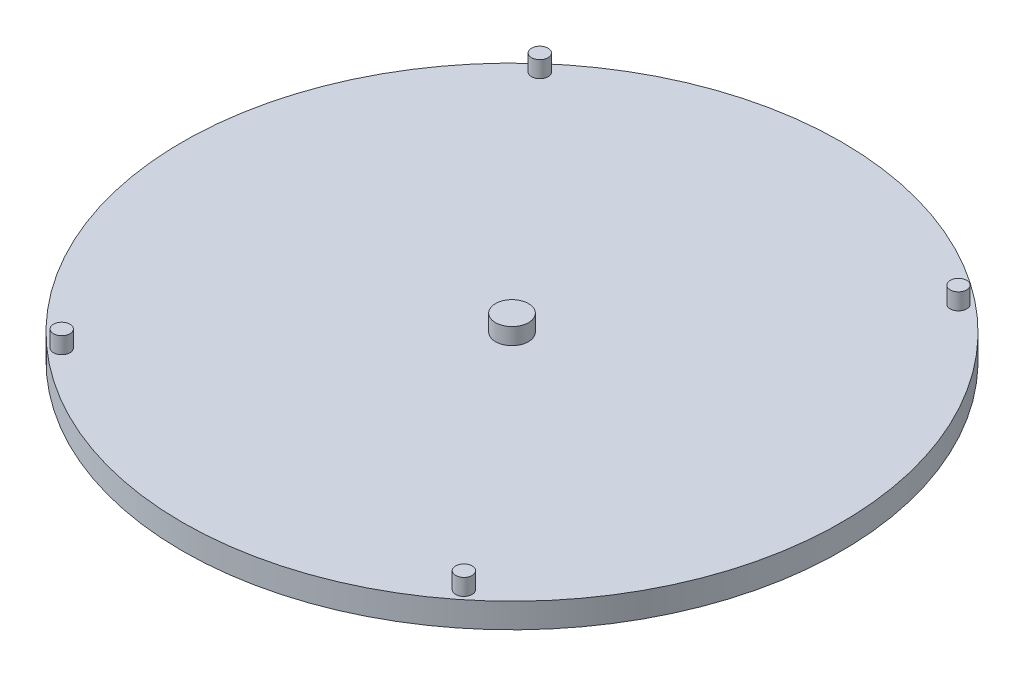
ISO-10303-21;
HEADER;
FILE_DESCRIPTION(('STEP AP214'),'2;1');
FILE_NAME('part.step','',(''),(''),'','','');
FILE_SCHEMA(('AUTOMOTIVE_DESIGN { 1 0 10303 214 1 1 1 1 }'));
ENDSEC;
DATA;
#1=APPLICATION_CONTEXT('core data for automotive mechanical design processes');
#2=APPLICATION_PROTOCOL_DEFINITION('international standard','automotive_design',2000,#1);
#3=PRODUCT_CONTEXT('',#1,'mechanical');
#4=PRODUCT('Part','Part','',(#3));
#5=PRODUCT_RELATED_PRODUCT_CATEGORY('part','',(#4));
#6=PRODUCT_DEFINITION_FORMATION('','',#4);
#7=PRODUCT_DEFINITION_CONTEXT('part definition',#1,'design');
#8=PRODUCT_DEFINITION('design','',#6,#7);
#9=PRODUCT_DEFINITION_SHAPE('','',#8);
#10=(LENGTH_UNIT() NAMED_UNIT(*) SI_UNIT(.MILLI.,.METRE.));
#11=(NAMED_UNIT(*) PLANE_ANGLE_UNIT() SI_UNIT($,.RADIAN.));
#12=(NAMED_UNIT(*) SI_UNIT($,.STERADIAN.) SOLID_ANGLE_UNIT());
#13=UNCERTAINTY_MEASURE_WITH_UNIT(LENGTH_MEASURE(1.E-05),#10,'distance_accuracy_value','');
#14=(GEOMETRIC_REPRESENTATION_CONTEXT(3) GLOBAL_UNCERTAINTY_ASSIGNED_CONTEXT((#13)) GLOBAL_UNIT_ASSIGNED_CONTEXT((#10,
#11,#12)) REPRESENTATION_CONTEXT('',''));
#15=CARTESIAN_POINT('',(0.,0.,0.));
#16=DIRECTION('',(0.,0.,1.));
#17=DIRECTION('',(1.,0.,0.));
#18=AXIS2_PLACEMENT_3D('',#15,#16,#17);
#19=CARTESIAN_POINT('',(0.,3.,0.));
#20=DIRECTION('',(0.,1.,0.));
#21=DIRECTION('',(0.,0.,1.));
#22=AXIS2_PLACEMENT_3D('',#19,#20,#21);
#23=PLANE('',#22);
#24=CARTESIAN_POINT('',(0.,3.,0.));
#25=DIRECTION('',(0.,1.,0.));
#26=DIRECTION('',(0.,0.,1.));
#27=AXIS2_PLACEMENT_3D('',#24,#25,#26);
#28=CIRCLE('',#27,2.);
#29=CARTESIAN_POINT('',(0.,3.,2.));
#30=VERTEX_POINT('',#29);
#31=EDGE_CURVE('E74',#30,#30,#28,.T.);
#32=ORIENTED_EDGE('',*,*,#31,.F.);
#33=EDGE_LOOP('',(#32));
#34=FACE_BOUND('',#33,.T.);
#35=CARTESIAN_POINT('',(24.1039137179365,3.,29.932057928602));
#36=DIRECTION('',(0.,1.,0.));
#37=DIRECTION('',(0.,0.,1.));
#38=AXIS2_PLACEMENT_3D('',#35,#36,#37);
#39=CIRCLE('',#38,1.);
#40=CARTESIAN_POINT('',(24.1039137179365,3.,30.932057928602));
#41=VERTEX_POINT('',#40);
#42=EDGE_CURVE('E55',#41,#41,#39,.T.);
#43=ORIENTED_EDGE('',*,*,#42,.F.);
#44=EDGE_LOOP('',(#43));
#45=FACE_BOUND('',#44,.T.);
#46=CARTESIAN_POINT('',(24.1039137179365,3.,-29.9806765580856));
#47=DIRECTION('',(0.,1.,0.));
#48=DIRECTION('',(0.,0.,1.));
#49=AXIS2_PLACEMENT_3D('',#46,#47,#48);
#50=CIRCLE('',#49,1.);
#51=CARTESIAN_POINT('',(24.1039137179365,3.,-28.9806765580856));
#52=VERTEX_POINT('',#51);
#53=EDGE_CURVE('E48',#52,#52,#50,.T.);
#54=ORIENTED_EDGE('',*,*,#53,.F.);
#55=EDGE_LOOP('',(#54));
#56=FACE_BOUND('',#55,.T.);
#57=CARTESIAN_POINT('',(0.,3.,0.));
#58=DIRECTION('',(0.,1.,0.));
#59=DIRECTION('',(0.,0.,1.));
#60=AXIS2_PLACEMENT_3D('',#57,#58,#59);
#61=CIRCLE('',#60,39.9214841251947);
#62=CARTESIAN_POINT('',(0.,3.,39.9214841251947));
#63=VERTEX_POINT('',#62);
#64=EDGE_CURVE('E10',#63,#63,#61,.T.);
#65=ORIENTED_EDGE('',*,*,#64,.T.);
#66=EDGE_LOOP('',(#65));
#67=FACE_BOUND('',#66,.T.);
#68=CARTESIAN_POINT('',(-25.6103171257812,3.,-28.9806765580856));
#69=DIRECTION('',(0.,1.,0.));
#70=DIRECTION('',(0.,0.,1.));
#71=AXIS2_PLACEMENT_3D('',#68,#69,#70);
#72=CIRCLE('',#71,1.);
#73=CARTESIAN_POINT('',(-25.6103171257812,3.,-27.9806765580856));
#74=VERTEX_POINT('',#73);
#75=EDGE_CURVE('E52',#74,#74,#72,.T.);
#76=ORIENTED_EDGE('',*,*,#75,.F.);
#77=EDGE_LOOP('',(#76));
#78=FACE_BOUND('',#77,.T.);
#79=CARTESIAN_POINT('',(-25.6103171257812,3.,28.932057928602));
#80=DIRECTION('',(0.,1.,0.));
#81=DIRECTION('',(0.,0.,1.));
#82=AXIS2_PLACEMENT_3D('',#79,#80,#81);
#83=CIRCLE('',#82,1.);
#84=CARTESIAN_POINT('',(-25.6103171257812,3.,29.932057928602));
#85=VERTEX_POINT('',#84);
#86=EDGE_CURVE('E58',#85,#85,#83,.T.);
#87=ORIENTED_EDGE('',*,*,#86,.F.);
#88=EDGE_LOOP('',(#87));
#89=FACE_BOUND('',#88,.T.);
#90=ADVANCED_FACE('F37',(#34,#45,#56,#67,#78,#89),#23,.T.);
#91=CARTESIAN_POINT('',(0.,0.,0.));
#92=DIRECTION('',(0.,1.,0.));
#93=DIRECTION('',(0.,0.,1.));
#94=AXIS2_PLACEMENT_3D('',#91,#92,#93);
#95=PLANE('',#94);
#96=CARTESIAN_POINT('',(0.,0.,0.));
#97=DIRECTION('',(0.,1.,0.));
#98=DIRECTION('',(0.,0.,1.));
#99=AXIS2_PLACEMENT_3D('',#96,#97,#98);
#100=CIRCLE('',#99,39.9214841251947);
#101=CARTESIAN_POINT('',(0.,0.,39.9214841251947));
#102=VERTEX_POINT('',#101);
#103=EDGE_CURVE('E41',#102,#102,#100,.T.);
#104=ORIENTED_EDGE('',*,*,#103,.F.);
#105=EDGE_LOOP('',(#104));
#106=FACE_BOUND('',#105,.T.);
#107=ADVANCED_FACE('F91',(#106),#95,.F.);
#108=CARTESIAN_POINT('',(0.,3.,0.));
#109=DIRECTION('',(0.,-1.,0.));
#110=DIRECTION('',(0.,0.,-1.));
#111=AXIS2_PLACEMENT_3D('',#108,#109,#110);
#112=CYLINDRICAL_SURFACE('',#111,39.9214841251947);
#113=ORIENTED_EDGE('',*,*,#64,.F.);
#114=EDGE_LOOP('',(#113));
#115=FACE_BOUND('',#114,.T.);
#116=ORIENTED_EDGE('',*,*,#103,.T.);
#117=EDGE_LOOP('',(#116));
#118=FACE_BOUND('',#117,.T.);
#119=ADVANCED_FACE('F39',(#115,#118),#112,.T.);
#120=CARTESIAN_POINT('',(-25.6103171257812,5.,-28.9806765580856));
#121=DIRECTION('',(0.,-1.,0.));
#122=DIRECTION('',(0.,0.,-1.));
#123=AXIS2_PLACEMENT_3D('',#120,#121,#122);
#124=CYLINDRICAL_SURFACE('',#123,1.);
#125=ORIENTED_EDGE('',*,*,#75,.T.);
#126=EDGE_LOOP('',(#125));
#127=FACE_BOUND('',#126,.T.);
#128=CARTESIAN_POINT('',(-25.6103171257812,5.,-28.9806765580856));
#129=DIRECTION('',(0.,1.,0.));
#130=DIRECTION('',(0.,0.,1.));
#131=AXIS2_PLACEMENT_3D('',#128,#129,#130);
#132=CIRCLE('',#131,1.);
#133=CARTESIAN_POINT('',(-25.6103171257812,5.,-27.9806765580856));
#134=VERTEX_POINT('',#133);
#135=EDGE_CURVE('E61',#134,#134,#132,.T.);
#136=ORIENTED_EDGE('',*,*,#135,.F.);
#137=EDGE_LOOP('',(#136));
#138=FACE_BOUND('',#137,.T.);
#139=ADVANCED_FACE('F122',(#127,#138),#124,.T.);
#140=CARTESIAN_POINT('',(0.,5.,0.));
#141=DIRECTION('',(0.,1.,0.));
#142=DIRECTION('',(0.,0.,1.));
#143=AXIS2_PLACEMENT_3D('',#140,#141,#142);
#144=PLANE('',#143);
#145=ORIENTED_EDGE('',*,*,#135,.T.);
#146=EDGE_LOOP('',(#145));
#147=FACE_BOUND('',#146,.T.);
#148=ADVANCED_FACE('F105',(#147),#144,.T.);
#149=CARTESIAN_POINT('',(-25.6103171257812,5.,28.932057928602));
#150=DIRECTION('',(0.,-1.,0.));
#151=DIRECTION('',(0.,0.,-1.));
#152=AXIS2_PLACEMENT_3D('',#149,#150,#151);
#153=CYLINDRICAL_SURFACE('',#152,1.);
#154=ORIENTED_EDGE('',*,*,#86,.T.);
#155=EDGE_LOOP('',(#154));
#156=FACE_BOUND('',#155,.T.);
#157=CARTESIAN_POINT('',(-25.6103171257812,5.,28.932057928602));
#158=DIRECTION('',(0.,1.,0.));
#159=DIRECTION('',(0.,0.,1.));
#160=AXIS2_PLACEMENT_3D('',#157,#158,#159);
#161=CIRCLE('',#160,1.);
#162=CARTESIAN_POINT('',(-25.6103171257812,5.,29.932057928602));
#163=VERTEX_POINT('',#162);
#164=EDGE_CURVE('E64',#163,#163,#161,.T.);
#165=ORIENTED_EDGE('',*,*,#164,.F.);
#166=EDGE_LOOP('',(#165));
#167=FACE_BOUND('',#166,.T.);
#168=ADVANCED_FACE('F101',(#156,#167),#153,.T.);
#169=CARTESIAN_POINT('',(0.,5.,0.));
#170=DIRECTION('',(0.,1.,0.));
#171=DIRECTION('',(0.,0.,1.));
#172=AXIS2_PLACEMENT_3D('',#169,#170,#171);
#173=PLANE('',#172);
#174=ORIENTED_EDGE('',*,*,#164,.T.);
#175=EDGE_LOOP('',(#174));
#176=FACE_BOUND('',#175,.T.);
#177=ADVANCED_FACE('F104',(#176),#173,.T.);
#178=CARTESIAN_POINT('',(24.1039137179365,5.,29.932057928602));
#179=DIRECTION('',(0.,-1.,0.));
#180=DIRECTION('',(0.,0.,-1.));
#181=AXIS2_PLACEMENT_3D('',#178,#179,#180);
#182=CYLINDRICAL_SURFACE('',#181,1.);
#183=ORIENTED_EDGE('',*,*,#42,.T.);
#184=EDGE_LOOP('',(#183));
#185=FACE_BOUND('',#184,.T.);
#186=CARTESIAN_POINT('',(24.1039137179365,5.,29.932057928602));
#187=DIRECTION('',(0.,1.,0.));
#188=DIRECTION('',(0.,0.,1.));
#189=AXIS2_PLACEMENT_3D('',#186,#187,#188);
#190=CIRCLE('',#189,1.);
#191=CARTESIAN_POINT('',(24.1039137179365,5.,30.932057928602));
#192=VERTEX_POINT('',#191);
#193=EDGE_CURVE('E67',#192,#192,#190,.T.);
#194=ORIENTED_EDGE('',*,*,#193,.F.);
#195=EDGE_LOOP('',(#194));
#196=FACE_BOUND('',#195,.T.);
#197=ADVANCED_FACE('F110',(#185,#196),#182,.T.);
#198=CARTESIAN_POINT('',(0.,5.,0.));
#199=DIRECTION('',(0.,1.,0.));
#200=DIRECTION('',(0.,0.,1.));
#201=AXIS2_PLACEMENT_3D('',#198,#199,#200);
#202=PLANE('',#201);
#203=ORIENTED_EDGE('',*,*,#193,.T.);
#204=EDGE_LOOP('',(#203));
#205=FACE_BOUND('',#204,.T.);
#206=ADVANCED_FACE('F115',(#205),#202,.T.);
#207=CARTESIAN_POINT('',(24.1039137179365,5.,-29.9806765580856));
#208=DIRECTION('',(0.,-1.,0.));
#209=DIRECTION('',(0.,0.,-1.));
#210=AXIS2_PLACEMENT_3D('',#207,#208,#209);
#211=CYLINDRICAL_SURFACE('',#210,1.);
#212=ORIENTED_EDGE('',*,*,#53,.T.);
#213=EDGE_LOOP('',(#212));
#214=FACE_BOUND('',#213,.T.);
#215=CARTESIAN_POINT('',(24.1039137179365,5.,-29.9806765580856));
#216=DIRECTION('',(0.,1.,0.));
#217=DIRECTION('',(0.,0.,1.));
#218=AXIS2_PLACEMENT_3D('',#215,#216,#217);
#219=CIRCLE('',#218,1.);
#220=CARTESIAN_POINT('',(24.1039137179365,5.,-28.9806765580856));
#221=VERTEX_POINT('',#220);
#222=EDGE_CURVE('E70',#221,#221,#219,.T.);
#223=ORIENTED_EDGE('',*,*,#222,.F.);
#224=EDGE_LOOP('',(#223));
#225=FACE_BOUND('',#224,.T.);
#226=ADVANCED_FACE('F170',(#214,#225),#211,.T.);
#227=CARTESIAN_POINT('',(0.,5.,0.));
#228=DIRECTION('',(0.,1.,0.));
#229=DIRECTION('',(0.,0.,1.));
#230=AXIS2_PLACEMENT_3D('',#227,#228,#229);
#231=PLANE('',#230);
#232=ORIENTED_EDGE('',*,*,#222,.T.);
#233=EDGE_LOOP('',(#232));
#234=FACE_BOUND('',#233,.T.);
#235=ADVANCED_FACE('F85',(#234),#231,.T.);
#236=CARTESIAN_POINT('',(0.,5.,0.));
#237=DIRECTION('',(0.,-1.,0.));
#238=DIRECTION('',(0.,0.,-1.));
#239=AXIS2_PLACEMENT_3D('',#236,#237,#238);
#240=CYLINDRICAL_SURFACE('',#239,2.);
#241=CARTESIAN_POINT('',(0.,5.,0.));
#242=DIRECTION('',(0.,1.,0.));
#243=DIRECTION('',(0.,0.,1.));
#244=AXIS2_PLACEMENT_3D('',#241,#242,#243);
#245=CIRCLE('',#244,2.);
#246=CARTESIAN_POINT('',(0.,5.,2.));
#247=VERTEX_POINT('',#246);
#248=EDGE_CURVE('E73',#247,#247,#245,.T.);
#249=ORIENTED_EDGE('',*,*,#248,.F.);
#250=EDGE_LOOP('',(#249));
#251=FACE_BOUND('',#250,.T.);
#252=ORIENTED_EDGE('',*,*,#31,.T.);
#253=EDGE_LOOP('',(#252));
#254=FACE_BOUND('',#253,.T.);
#255=ADVANCED_FACE('F82',(#251,#254),#240,.T.);
#256=CARTESIAN_POINT('',(0.,5.,0.));
#257=DIRECTION('',(0.,1.,0.));
#258=DIRECTION('',(0.,0.,1.));
#259=AXIS2_PLACEMENT_3D('',#256,#257,#258);
#260=PLANE('',#259);
#261=ORIENTED_EDGE('',*,*,#248,.T.);
#262=EDGE_LOOP('',(#261));
#263=FACE_BOUND('',#262,.T.);
#264=ADVANCED_FACE('F80',(#263),#260,.T.);
#265=CLOSED_SHELL('',(#90,#107,#119,#139,#148,#168,#177,#197,#206,#226,#235,#255,#264));
#266=MANIFOLD_SOLID_BREP('B2',#265);
#267=ADVANCED_BREP_SHAPE_REPRESENTATION('',(#18,#266),#14);
#268=SHAPE_DEFINITION_REPRESENTATION(#9,#267);
ENDSEC;
END-ISO-10303-21;
